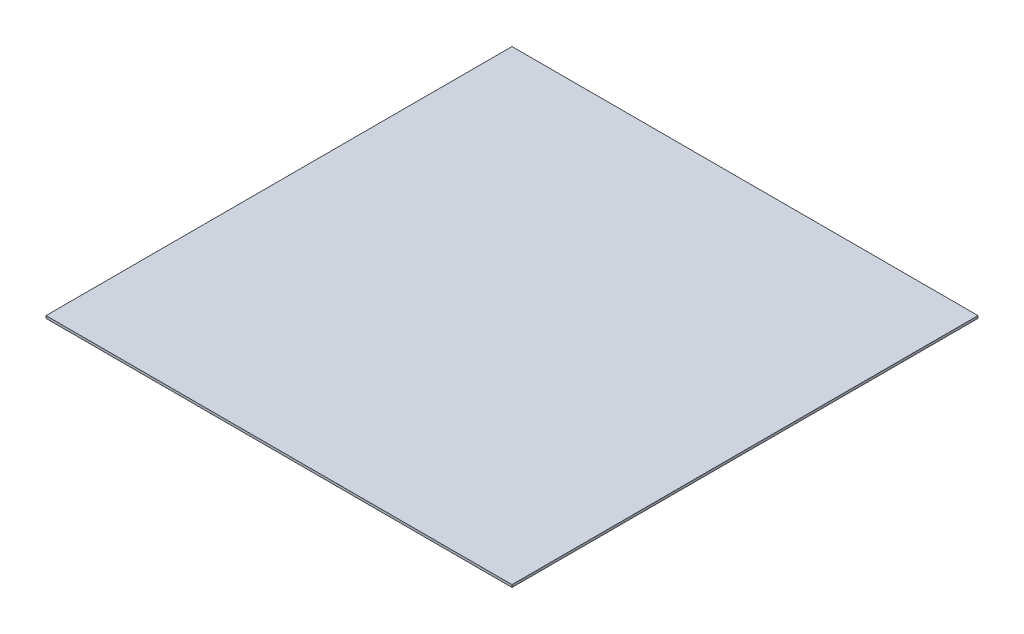
ISO-10303-21;
HEADER;
FILE_DESCRIPTION(('STEP AP214'),'2;1');
FILE_NAME('part.step','',(''),(''),'','','');
FILE_SCHEMA(('AUTOMOTIVE_DESIGN { 1 0 10303 214 1 1 1 1 }'));
ENDSEC;
DATA;
#1=APPLICATION_CONTEXT('core data for automotive mechanical design processes');
#2=APPLICATION_PROTOCOL_DEFINITION('international standard','automotive_design',2000,#1);
#3=PRODUCT_CONTEXT('',#1,'mechanical');
#4=PRODUCT('Part','Part','',(#3));
#5=PRODUCT_RELATED_PRODUCT_CATEGORY('part','',(#4));
#6=PRODUCT_DEFINITION_FORMATION('','',#4);
#7=PRODUCT_DEFINITION_CONTEXT('part definition',#1,'design');
#8=PRODUCT_DEFINITION('design','',#6,#7);
#9=PRODUCT_DEFINITION_SHAPE('','',#8);
#10=(LENGTH_UNIT() NAMED_UNIT(*) SI_UNIT(.MILLI.,.METRE.));
#11=(NAMED_UNIT(*) PLANE_ANGLE_UNIT() SI_UNIT($,.RADIAN.));
#12=(NAMED_UNIT(*) SI_UNIT($,.STERADIAN.) SOLID_ANGLE_UNIT());
#13=UNCERTAINTY_MEASURE_WITH_UNIT(LENGTH_MEASURE(1.E-05),#10,'distance_accuracy_value','');
#14=(GEOMETRIC_REPRESENTATION_CONTEXT(3) GLOBAL_UNCERTAINTY_ASSIGNED_CONTEXT((#13)) GLOBAL_UNIT_ASSIGNED_CONTEXT((#10,
#11,#12)) REPRESENTATION_CONTEXT('',''));
#15=CARTESIAN_POINT('',(0.,0.,0.));
#16=DIRECTION('',(0.,0.,1.));
#17=DIRECTION('',(1.,0.,0.));
#18=AXIS2_PLACEMENT_3D('',#15,#16,#17);
#19=CARTESIAN_POINT('',(0.,3.,0.));
#20=DIRECTION('',(1.,0.,0.));
#21=DIRECTION('',(0.,0.,-1.));
#22=AXIS2_PLACEMENT_3D('',#19,#20,#21);
#23=PLANE('',#22);
#24=DIRECTION('',(0.,0.,1.));
#25=VECTOR('',#24,1.);
#26=CARTESIAN_POINT('',(0.,0.,0.));
#27=LINE('',#26,#25);
#28=CARTESIAN_POINT('',(0.,0.,-566.));
#29=VERTEX_POINT('',#28);
#30=CARTESIAN_POINT('',(0.,0.,0.));
#31=VERTEX_POINT('',#30);
#32=EDGE_CURVE('E96',#29,#31,#27,.T.);
#33=ORIENTED_EDGE('',*,*,#32,.T.);
#34=DIRECTION('',(0.,-1.,0.));
#35=VECTOR('',#34,1.);
#36=CARTESIAN_POINT('',(0.,3.,0.));
#37=LINE('',#36,#35);
#38=CARTESIAN_POINT('',(0.,3.,0.));
#39=VERTEX_POINT('',#38);
#40=EDGE_CURVE('E11',#39,#31,#37,.T.);
#41=ORIENTED_EDGE('',*,*,#40,.F.);
#42=DIRECTION('',(0.,0.,1.));
#43=VECTOR('',#42,1.);
#44=CARTESIAN_POINT('',(0.,3.,0.));
#45=LINE('',#44,#43);
#46=CARTESIAN_POINT('',(0.,3.,-566.));
#47=VERTEX_POINT('',#46);
#48=EDGE_CURVE('E84',#47,#39,#45,.T.);
#49=ORIENTED_EDGE('',*,*,#48,.F.);
#50=DIRECTION('',(0.,-1.,0.));
#51=VECTOR('',#50,1.);
#52=CARTESIAN_POINT('',(0.,3.,-566.));
#53=LINE('',#52,#51);
#54=EDGE_CURVE('E92',#47,#29,#53,.T.);
#55=ORIENTED_EDGE('',*,*,#54,.T.);
#56=EDGE_LOOP('',(#33,#41,#49,#55));
#57=FACE_BOUND('',#56,.T.);
#58=ADVANCED_FACE('F33',(#57),#23,.F.);
#59=CARTESIAN_POINT('',(0.,3.,0.));
#60=DIRECTION('',(0.,0.,-1.));
#61=DIRECTION('',(-1.,0.,0.));
#62=AXIS2_PLACEMENT_3D('',#59,#60,#61);
#63=PLANE('',#62);
#64=DIRECTION('',(1.,0.,0.));
#65=VECTOR('',#64,1.);
#66=CARTESIAN_POINT('',(0.,0.,0.));
#67=LINE('',#66,#65);
#68=CARTESIAN_POINT('',(566.,0.,0.));
#69=VERTEX_POINT('',#68);
#70=EDGE_CURVE('E88',#31,#69,#67,.T.);
#71=ORIENTED_EDGE('',*,*,#70,.T.);
#72=DIRECTION('',(0.,-1.,0.));
#73=VECTOR('',#72,1.);
#74=CARTESIAN_POINT('',(566.,3.,0.));
#75=LINE('',#74,#73);
#76=CARTESIAN_POINT('',(566.,3.,0.));
#77=VERTEX_POINT('',#76);
#78=EDGE_CURVE('E41',#77,#69,#75,.T.);
#79=ORIENTED_EDGE('',*,*,#78,.F.);
#80=DIRECTION('',(1.,0.,0.));
#81=VECTOR('',#80,1.);
#82=CARTESIAN_POINT('',(0.,3.,0.));
#83=LINE('',#82,#81);
#84=EDGE_CURVE('E79',#39,#77,#83,.T.);
#85=ORIENTED_EDGE('',*,*,#84,.F.);
#86=ORIENTED_EDGE('',*,*,#40,.T.);
#87=EDGE_LOOP('',(#71,#79,#85,#86));
#88=FACE_BOUND('',#87,.T.);
#89=ADVANCED_FACE('F87',(#88),#63,.F.);
#90=CARTESIAN_POINT('',(566.,3.,0.));
#91=DIRECTION('',(-1.,0.,0.));
#92=DIRECTION('',(0.,0.,1.));
#93=AXIS2_PLACEMENT_3D('',#90,#91,#92);
#94=PLANE('',#93);
#95=DIRECTION('',(0.,0.,-1.));
#96=VECTOR('',#95,1.);
#97=CARTESIAN_POINT('',(566.,0.,0.));
#98=LINE('',#97,#96);
#99=CARTESIAN_POINT('',(566.,0.,-566.));
#100=VERTEX_POINT('',#99);
#101=EDGE_CURVE('E66',#69,#100,#98,.T.);
#102=ORIENTED_EDGE('',*,*,#101,.T.);
#103=DIRECTION('',(0.,-1.,0.));
#104=VECTOR('',#103,1.);
#105=CARTESIAN_POINT('',(566.,3.,-566.));
#106=LINE('',#105,#104);
#107=CARTESIAN_POINT('',(566.,3.,-566.));
#108=VERTEX_POINT('',#107);
#109=EDGE_CURVE('E89',#108,#100,#106,.T.);
#110=ORIENTED_EDGE('',*,*,#109,.F.);
#111=DIRECTION('',(0.,0.,-1.));
#112=VECTOR('',#111,1.);
#113=CARTESIAN_POINT('',(566.,3.,0.));
#114=LINE('',#113,#112);
#115=EDGE_CURVE('E82',#77,#108,#114,.T.);
#116=ORIENTED_EDGE('',*,*,#115,.F.);
#117=ORIENTED_EDGE('',*,*,#78,.T.);
#118=EDGE_LOOP('',(#102,#110,#116,#117));
#119=FACE_BOUND('',#118,.T.);
#120=ADVANCED_FACE('F90',(#119),#94,.F.);
#121=CARTESIAN_POINT('',(0.,3.,-566.));
#122=DIRECTION('',(0.,0.,1.));
#123=DIRECTION('',(1.,0.,0.));
#124=AXIS2_PLACEMENT_3D('',#121,#122,#123);
#125=PLANE('',#124);
#126=DIRECTION('',(-1.,0.,0.));
#127=VECTOR('',#126,1.);
#128=CARTESIAN_POINT('',(0.,0.,-566.));
#129=LINE('',#128,#127);
#130=EDGE_CURVE('E72',#100,#29,#129,.T.);
#131=ORIENTED_EDGE('',*,*,#130,.T.);
#132=ORIENTED_EDGE('',*,*,#54,.F.);
#133=DIRECTION('',(-1.,0.,0.));
#134=VECTOR('',#133,1.);
#135=CARTESIAN_POINT('',(0.,3.,-566.));
#136=LINE('',#135,#134);
#137=EDGE_CURVE('E49',#108,#47,#136,.T.);
#138=ORIENTED_EDGE('',*,*,#137,.F.);
#139=ORIENTED_EDGE('',*,*,#109,.T.);
#140=EDGE_LOOP('',(#131,#132,#138,#139));
#141=FACE_BOUND('',#140,.T.);
#142=ADVANCED_FACE('F103',(#141),#125,.F.);
#143=CARTESIAN_POINT('',(0.,3.,0.));
#144=DIRECTION('',(0.,-1.,0.));
#145=DIRECTION('',(0.,0.,-1.));
#146=AXIS2_PLACEMENT_3D('',#143,#144,#145);
#147=PLANE('',#146);
#148=ORIENTED_EDGE('',*,*,#48,.T.);
#149=ORIENTED_EDGE('',*,*,#84,.T.);
#150=ORIENTED_EDGE('',*,*,#115,.T.);
#151=ORIENTED_EDGE('',*,*,#137,.T.);
#152=EDGE_LOOP('',(#148,#149,#150,#151));
#153=FACE_BOUND('',#152,.T.);
#154=ADVANCED_FACE('F80',(#153),#147,.F.);
#155=CARTESIAN_POINT('',(0.,0.,0.));
#156=DIRECTION('',(0.,-1.,0.));
#157=DIRECTION('',(0.,0.,-1.));
#158=AXIS2_PLACEMENT_3D('',#155,#156,#157);
#159=PLANE('',#158);
#160=ORIENTED_EDGE('',*,*,#32,.F.);
#161=ORIENTED_EDGE('',*,*,#130,.F.);
#162=ORIENTED_EDGE('',*,*,#101,.F.);
#163=ORIENTED_EDGE('',*,*,#70,.F.);
#164=EDGE_LOOP('',(#160,#161,#162,#163));
#165=FACE_BOUND('',#164,.T.);
#166=ADVANCED_FACE('F106',(#165),#159,.T.);
#167=CLOSED_SHELL('',(#58,#89,#120,#142,#154,#166));
#168=MANIFOLD_SOLID_BREP('B2',#167);
#169=ADVANCED_BREP_SHAPE_REPRESENTATION('',(#18,#168),#14);
#170=SHAPE_DEFINITION_REPRESENTATION(#9,#169);
ENDSEC;
END-ISO-10303-21;
